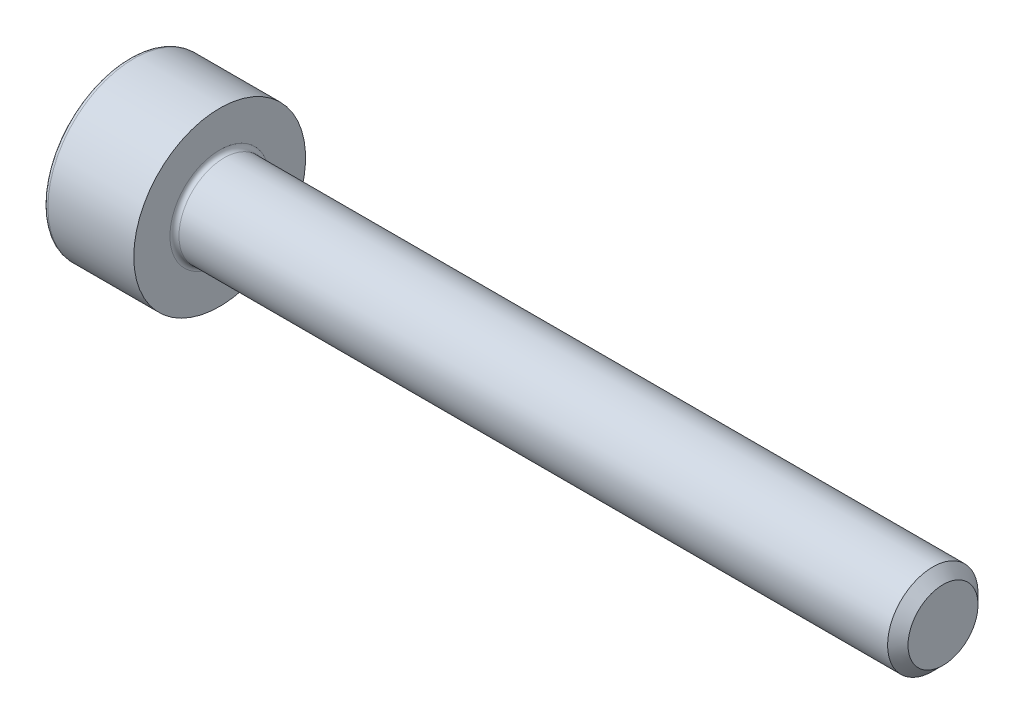
ISO-10303-21;
HEADER;
FILE_DESCRIPTION(('STEP AP214'),'2;1');
FILE_NAME('part.step','',(''),(''),'','','');
FILE_SCHEMA(('AUTOMOTIVE_DESIGN { 1 0 10303 214 1 1 1 1 }'));
ENDSEC;
DATA;
#1=APPLICATION_CONTEXT('core data for automotive mechanical design processes');
#2=APPLICATION_PROTOCOL_DEFINITION('international standard','automotive_design',2000,#1);
#3=PRODUCT_CONTEXT('',#1,'mechanical');
#4=PRODUCT('Part','Part','',(#3));
#5=PRODUCT_RELATED_PRODUCT_CATEGORY('part','',(#4));
#6=PRODUCT_DEFINITION_FORMATION('','',#4);
#7=PRODUCT_DEFINITION_CONTEXT('part definition',#1,'design');
#8=PRODUCT_DEFINITION('design','',#6,#7);
#9=PRODUCT_DEFINITION_SHAPE('','',#8);
#10=(LENGTH_UNIT() NAMED_UNIT(*) SI_UNIT(.MILLI.,.METRE.));
#11=(NAMED_UNIT(*) PLANE_ANGLE_UNIT() SI_UNIT($,.RADIAN.));
#12=(NAMED_UNIT(*) SI_UNIT($,.STERADIAN.) SOLID_ANGLE_UNIT());
#13=UNCERTAINTY_MEASURE_WITH_UNIT(LENGTH_MEASURE(1.E-05),#10,'distance_accuracy_value','');
#14=(GEOMETRIC_REPRESENTATION_CONTEXT(3) GLOBAL_UNCERTAINTY_ASSIGNED_CONTEXT((#13)) GLOBAL_UNIT_ASSIGNED_CONTEXT((#10,
#11,#12)) REPRESENTATION_CONTEXT('',''));
#15=CARTESIAN_POINT('',(0.,0.,0.));
#16=DIRECTION('',(0.,0.,1.));
#17=DIRECTION('',(1.,0.,0.));
#18=AXIS2_PLACEMENT_3D('',#15,#16,#17);
#19=CARTESIAN_POINT('',(0.,0.,0.));
#20=DIRECTION('',(-1.,0.,0.));
#21=DIRECTION('',(0.,0.,1.));
#22=AXIS2_PLACEMENT_3D('',#19,#20,#21);
#23=PLANE('',#22);
#24=DIRECTION('',(0.,-0.499999999999999,0.866025403784439));
#25=VECTOR('',#24,1.);
#26=CARTESIAN_POINT('',(0.,0.892006165897972,0.));
#27=LINE('',#26,#25);
#28=CARTESIAN_POINT('',(0.,0.892006165897972,0.));
#29=VERTEX_POINT('',#28);
#30=CARTESIAN_POINT('',(0.,0.446003082948987,0.772499999999999));
#31=VERTEX_POINT('',#30);
#32=EDGE_CURVE('E265',#29,#31,#27,.T.);
#33=ORIENTED_EDGE('',*,*,#32,.T.);
#34=DIRECTION('',(0.,1.,0.));
#35=VECTOR('',#34,1.);
#36=CARTESIAN_POINT('',(0.,-0.446003082948984,0.7725));
#37=LINE('',#36,#35);
#38=CARTESIAN_POINT('',(0.,-0.446003082948984,0.7725));
#39=VERTEX_POINT('',#38);
#40=EDGE_CURVE('E137',#39,#31,#37,.T.);
#41=ORIENTED_EDGE('',*,*,#40,.F.);
#42=DIRECTION('',(0.,-0.500000000000001,-0.866025403784438));
#43=VECTOR('',#42,1.);
#44=CARTESIAN_POINT('',(0.,-0.446003082948984,0.7725));
#45=LINE('',#44,#43);
#46=CARTESIAN_POINT('',(0.,-0.892006165897971,0.));
#47=VERTEX_POINT('',#46);
#48=EDGE_CURVE('E268',#39,#47,#45,.T.);
#49=ORIENTED_EDGE('',*,*,#48,.T.);
#50=DIRECTION('',(0.,0.499999999999997,-0.86602540378444));
#51=VECTOR('',#50,1.);
#52=CARTESIAN_POINT('',(0.,-0.892006165897971,0.));
#53=LINE('',#52,#51);
#54=CARTESIAN_POINT('',(0.,-0.446003082948987,-0.772500000000001));
#55=VERTEX_POINT('',#54);
#56=EDGE_CURVE('E271',#47,#55,#53,.T.);
#57=ORIENTED_EDGE('',*,*,#56,.T.);
#58=DIRECTION('',(0.,-1.,0.));
#59=VECTOR('',#58,1.);
#60=CARTESIAN_POINT('',(0.,0.446003082948986,-0.772500000000001));
#61=LINE('',#60,#59);
#62=CARTESIAN_POINT('',(0.,0.446003082948986,-0.772500000000001));
#63=VERTEX_POINT('',#62);
#64=EDGE_CURVE('E274',#63,#55,#61,.T.);
#65=ORIENTED_EDGE('',*,*,#64,.F.);
#66=DIRECTION('',(0.,-0.500000000000001,-0.866025403784438));
#67=VECTOR('',#66,1.);
#68=CARTESIAN_POINT('',(0.,0.892006165897972,0.));
#69=LINE('',#68,#67);
#70=EDGE_CURVE('E132',#29,#63,#69,.T.);
#71=ORIENTED_EDGE('',*,*,#70,.F.);
#72=EDGE_LOOP('',(#33,#41,#49,#57,#65,#71));
#73=FACE_BOUND('',#72,.T.);
#74=CARTESIAN_POINT('',(0.,0.,0.));
#75=DIRECTION('',(-1.,0.,0.));
#76=DIRECTION('',(0.,0.,1.));
#77=AXIS2_PLACEMENT_3D('',#74,#75,#76);
#78=CIRCLE('',#77,1.8);
#79=CARTESIAN_POINT('',(0.,0.,1.8));
#80=VERTEX_POINT('',#79);
#81=EDGE_CURVE('E49',#80,#80,#78,.T.);
#82=ORIENTED_EDGE('',*,*,#81,.T.);
#83=EDGE_LOOP('',(#82));
#84=FACE_BOUND('',#83,.T.);
#85=ADVANCED_FACE('F41',(#73,#84),#23,.T.);
#86=CARTESIAN_POINT('',(-31.75,0.,0.));
#87=DIRECTION('',(-1.,0.,0.));
#88=DIRECTION('',(0.,0.,1.));
#89=AXIS2_PLACEMENT_3D('',#86,#87,#88);
#90=CYLINDRICAL_SURFACE('',#89,1.9);
#91=CARTESIAN_POINT('',(0.100000000000003,0.,0.));
#92=DIRECTION('',(-1.,0.,0.));
#93=DIRECTION('',(0.,0.,1.));
#94=AXIS2_PLACEMENT_3D('',#91,#92,#93);
#95=CIRCLE('',#94,1.9);
#96=CARTESIAN_POINT('',(0.100000000000003,0.,1.9));
#97=VERTEX_POINT('',#96);
#98=EDGE_CURVE('E11',#97,#97,#95,.F.);
#99=ORIENTED_EDGE('',*,*,#98,.T.);
#100=EDGE_LOOP('',(#99));
#101=FACE_BOUND('',#100,.T.);
#102=CARTESIAN_POINT('',(2.,0.,0.));
#103=DIRECTION('',(-1.,0.,0.));
#104=DIRECTION('',(0.,0.,1.));
#105=AXIS2_PLACEMENT_3D('',#102,#103,#104);
#106=CIRCLE('',#105,1.9);
#107=CARTESIAN_POINT('',(2.,0.,1.9));
#108=VERTEX_POINT('',#107);
#109=EDGE_CURVE('E155',#108,#108,#106,.T.);
#110=ORIENTED_EDGE('',*,*,#109,.T.);
#111=EDGE_LOOP('',(#110));
#112=FACE_BOUND('',#111,.T.);
#113=ADVANCED_FACE('F179',(#101,#112),#90,.T.);
#114=CARTESIAN_POINT('',(2.00000000000001,1.9,0.));
#115=DIRECTION('',(1.,0.,0.));
#116=DIRECTION('',(0.,0.,-1.));
#117=AXIS2_PLACEMENT_3D('',#114,#115,#116);
#118=PLANE('',#117);
#119=CARTESIAN_POINT('',(2.00000000000001,0.,0.));
#120=DIRECTION('',(1.,0.,0.));
#121=DIRECTION('',(0.,0.,-1.));
#122=AXIS2_PLACEMENT_3D('',#119,#120,#121);
#123=CIRCLE('',#122,1.1);
#124=CARTESIAN_POINT('',(2.00000000000001,0.,-1.1));
#125=VERTEX_POINT('',#124);
#126=EDGE_CURVE('E158',#125,#125,#123,.F.);
#127=ORIENTED_EDGE('',*,*,#126,.T.);
#128=EDGE_LOOP('',(#127));
#129=FACE_BOUND('',#128,.T.);
#130=ORIENTED_EDGE('',*,*,#109,.F.);
#131=EDGE_LOOP('',(#130));
#132=FACE_BOUND('',#131,.T.);
#133=ADVANCED_FACE('F185',(#129,#132),#118,.T.);
#134=CARTESIAN_POINT('',(-31.75,0.,0.));
#135=DIRECTION('',(-1.,0.,0.));
#136=DIRECTION('',(0.,0.,1.));
#137=AXIS2_PLACEMENT_3D('',#134,#135,#136);
#138=CYLINDRICAL_SURFACE('',#137,1.);
#139=CARTESIAN_POINT('',(2.1,0.,0.));
#140=DIRECTION('',(1.,0.,0.));
#141=DIRECTION('',(0.,0.,-1.));
#142=AXIS2_PLACEMENT_3D('',#139,#140,#141);
#143=CIRCLE('',#142,1.);
#144=CARTESIAN_POINT('',(2.1,0.,-1.));
#145=VERTEX_POINT('',#144);
#146=EDGE_CURVE('E161',#145,#145,#143,.T.);
#147=ORIENTED_EDGE('',*,*,#146,.T.);
#148=EDGE_LOOP('',(#147));
#149=FACE_BOUND('',#148,.T.);
#150=CARTESIAN_POINT('',(17.774,0.,0.));
#151=DIRECTION('',(-1.,0.,0.));
#152=DIRECTION('',(0.,0.,1.));
#153=AXIS2_PLACEMENT_3D('',#150,#151,#152);
#154=CIRCLE('',#153,1.);
#155=CARTESIAN_POINT('',(17.774,0.,1.));
#156=VERTEX_POINT('',#155);
#157=EDGE_CURVE('E152',#156,#156,#154,.T.);
#158=ORIENTED_EDGE('',*,*,#157,.T.);
#159=EDGE_LOOP('',(#158));
#160=FACE_BOUND('',#159,.T.);
#161=ADVANCED_FACE('F191',(#149,#160),#138,.T.);
#162=CARTESIAN_POINT('',(18.,0.,0.));
#163=DIRECTION('',(-1.,0.,0.));
#164=DIRECTION('',(0.,0.,1.));
#165=AXIS2_PLACEMENT_3D('',#162,#163,#164);
#166=CONICAL_SURFACE('',#165,0.774,0.785398163397475);
#167=ORIENTED_EDGE('',*,*,#157,.F.);
#168=EDGE_LOOP('',(#167));
#169=FACE_BOUND('',#168,.T.);
#170=CARTESIAN_POINT('',(18.,0.,0.));
#171=DIRECTION('',(-1.,0.,0.));
#172=DIRECTION('',(0.,0.,1.));
#173=AXIS2_PLACEMENT_3D('',#170,#171,#172);
#174=CIRCLE('',#173,0.774);
#175=CARTESIAN_POINT('',(18.,0.,0.774));
#176=VERTEX_POINT('',#175);
#177=EDGE_CURVE('E148',#176,#176,#174,.T.);
#178=ORIENTED_EDGE('',*,*,#177,.T.);
#179=EDGE_LOOP('',(#178));
#180=FACE_BOUND('',#179,.T.);
#181=ADVANCED_FACE('F195',(#169,#180),#166,.T.);
#182=CARTESIAN_POINT('',(18.,0.774,0.));
#183=DIRECTION('',(1.,0.,0.));
#184=DIRECTION('',(0.,0.,-1.));
#185=AXIS2_PLACEMENT_3D('',#182,#183,#184);
#186=PLANE('',#185);
#187=ORIENTED_EDGE('',*,*,#177,.F.);
#188=EDGE_LOOP('',(#187));
#189=FACE_BOUND('',#188,.T.);
#190=ADVANCED_FACE('F175',(#189),#186,.T.);
#191=CARTESIAN_POINT('',(2.1,0.,0.));
#192=DIRECTION('',(1.,0.,0.));
#193=DIRECTION('',(0.,0.,-1.));
#194=AXIS2_PLACEMENT_3D('',#191,#192,#193);
#195=TOROIDAL_SURFACE('',#194,1.1,0.1);
#196=ORIENTED_EDGE('',*,*,#146,.F.);
#197=EDGE_LOOP('',(#196));
#198=FACE_BOUND('',#197,.T.);
#199=ORIENTED_EDGE('',*,*,#126,.F.);
#200=EDGE_LOOP('',(#199));
#201=FACE_BOUND('',#200,.T.);
#202=ADVANCED_FACE('F168',(#198,#201),#195,.F.);
#203=CARTESIAN_POINT('',(0.100000000000003,0.,0.));
#204=DIRECTION('',(-1.,0.,0.));
#205=DIRECTION('',(0.,0.,1.));
#206=AXIS2_PLACEMENT_3D('',#203,#204,#205);
#207=TOROIDAL_SURFACE('',#206,1.8,0.1);
#208=ORIENTED_EDGE('',*,*,#98,.F.);
#209=EDGE_LOOP('',(#208));
#210=FACE_BOUND('',#209,.T.);
#211=ORIENTED_EDGE('',*,*,#81,.F.);
#212=EDGE_LOOP('',(#211));
#213=FACE_BOUND('',#212,.T.);
#214=ADVANCED_FACE('F43',(#210,#213),#207,.T.);
#215=CARTESIAN_POINT('',(1.,0.892006165897972,0.));
#216=DIRECTION('',(0.,-0.866025403784439,-0.499999999999999));
#217=DIRECTION('',(0.,0.499999999999999,-0.866025403784439));
#218=AXIS2_PLACEMENT_3D('',#215,#216,#217);
#219=PLANE('',#218);
#220=ORIENTED_EDGE('',*,*,#32,.F.);
#221=DIRECTION('',(-1.,0.,0.));
#222=VECTOR('',#221,1.);
#223=CARTESIAN_POINT('',(1.,0.892006165897972,0.));
#224=LINE('',#223,#222);
#225=CARTESIAN_POINT('',(1.,0.892006165897972,0.));
#226=VERTEX_POINT('',#225);
#227=EDGE_CURVE('E255',#226,#29,#224,.T.);
#228=ORIENTED_EDGE('',*,*,#227,.F.);
#229=DIRECTION('',(0.,-0.499999999999999,0.866025403784439));
#230=VECTOR('',#229,1.);
#231=CARTESIAN_POINT('',(1.,0.892006165897972,0.));
#232=LINE('',#231,#230);
#233=CARTESIAN_POINT('',(1.,0.669004624423479,0.386249999999999));
#234=VERTEX_POINT('',#233);
#235=EDGE_CURVE('E124',#226,#234,#232,.T.);
#236=ORIENTED_EDGE('',*,*,#235,.T.);
#237=CARTESIAN_POINT('',(1.,0.446003082948987,0.772499999999999));
#238=VERTEX_POINT('',#237);
#239=EDGE_CURVE('E115',#234,#238,#232,.T.);
#240=ORIENTED_EDGE('',*,*,#239,.T.);
#241=DIRECTION('',(-1.,0.,0.));
#242=VECTOR('',#241,1.);
#243=CARTESIAN_POINT('',(1.,0.446003082948987,0.772499999999999));
#244=LINE('',#243,#242);
#245=EDGE_CURVE('E129',#238,#31,#244,.T.);
#246=ORIENTED_EDGE('',*,*,#245,.T.);
#247=EDGE_LOOP('',(#220,#228,#236,#240,#246));
#248=FACE_BOUND('',#247,.T.);
#249=ADVANCED_FACE('F128',(#248),#219,.T.);
#250=CARTESIAN_POINT('',(1.,-0.446003082948984,0.7725));
#251=DIRECTION('',(0.,0.,1.));
#252=DIRECTION('',(0.,-1.,0.));
#253=AXIS2_PLACEMENT_3D('',#250,#251,#252);
#254=PLANE('',#253);
#255=ORIENTED_EDGE('',*,*,#40,.T.);
#256=ORIENTED_EDGE('',*,*,#245,.F.);
#257=DIRECTION('',(0.,1.,0.));
#258=VECTOR('',#257,1.);
#259=CARTESIAN_POINT('',(1.,-0.446003082948984,0.7725));
#260=LINE('',#259,#258);
#261=CARTESIAN_POINT('',(1.,0.,0.772499999999999));
#262=VERTEX_POINT('',#261);
#263=EDGE_CURVE('E112',#262,#238,#260,.T.);
#264=ORIENTED_EDGE('',*,*,#263,.F.);
#265=CARTESIAN_POINT('',(1.,-0.446003082948984,0.7725));
#266=VERTEX_POINT('',#265);
#267=EDGE_CURVE('E123',#266,#262,#260,.T.);
#268=ORIENTED_EDGE('',*,*,#267,.F.);
#269=DIRECTION('',(-1.,0.,0.));
#270=VECTOR('',#269,1.);
#271=CARTESIAN_POINT('',(1.,-0.446003082948984,0.7725));
#272=LINE('',#271,#270);
#273=EDGE_CURVE('E139',#266,#39,#272,.T.);
#274=ORIENTED_EDGE('',*,*,#273,.T.);
#275=EDGE_LOOP('',(#255,#256,#264,#268,#274));
#276=FACE_BOUND('',#275,.T.);
#277=ADVANCED_FACE('F134',(#276),#254,.F.);
#278=CARTESIAN_POINT('',(1.,-0.446003082948984,0.7725));
#279=DIRECTION('',(0.,0.866025403784438,-0.500000000000001));
#280=DIRECTION('',(0.,0.500000000000001,0.866025403784438));
#281=AXIS2_PLACEMENT_3D('',#278,#279,#280);
#282=PLANE('',#281);
#283=ORIENTED_EDGE('',*,*,#48,.F.);
#284=ORIENTED_EDGE('',*,*,#273,.F.);
#285=DIRECTION('',(0.,-0.500000000000001,-0.866025403784438));
#286=VECTOR('',#285,1.);
#287=CARTESIAN_POINT('',(1.,-0.446003082948984,0.7725));
#288=LINE('',#287,#286);
#289=CARTESIAN_POINT('',(1.,-0.669004624423477,0.38625));
#290=VERTEX_POINT('',#289);
#291=EDGE_CURVE('E294',#266,#290,#288,.T.);
#292=ORIENTED_EDGE('',*,*,#291,.T.);
#293=CARTESIAN_POINT('',(1.,-0.892006165897971,0.));
#294=VERTEX_POINT('',#293);
#295=EDGE_CURVE('E283',#290,#294,#288,.T.);
#296=ORIENTED_EDGE('',*,*,#295,.T.);
#297=DIRECTION('',(-1.,0.,0.));
#298=VECTOR('',#297,1.);
#299=CARTESIAN_POINT('',(1.,-0.892006165897971,0.));
#300=LINE('',#299,#298);
#301=EDGE_CURVE('E144',#294,#47,#300,.T.);
#302=ORIENTED_EDGE('',*,*,#301,.T.);
#303=EDGE_LOOP('',(#283,#284,#292,#296,#302));
#304=FACE_BOUND('',#303,.T.);
#305=ADVANCED_FACE('F209',(#304),#282,.T.);
#306=CARTESIAN_POINT('',(1.,-0.892006165897971,0.));
#307=DIRECTION('',(0.,0.86602540378444,0.499999999999997));
#308=DIRECTION('',(0.,-0.499999999999997,0.86602540378444));
#309=AXIS2_PLACEMENT_3D('',#306,#307,#308);
#310=PLANE('',#309);
#311=ORIENTED_EDGE('',*,*,#56,.F.);
#312=ORIENTED_EDGE('',*,*,#301,.F.);
#313=DIRECTION('',(0.,0.499999999999997,-0.86602540378444));
#314=VECTOR('',#313,1.);
#315=CARTESIAN_POINT('',(1.,-0.892006165897971,0.));
#316=LINE('',#315,#314);
#317=CARTESIAN_POINT('',(1.,-0.66900462442348,-0.386249999999998));
#318=VERTEX_POINT('',#317);
#319=EDGE_CURVE('E261',#294,#318,#316,.T.);
#320=ORIENTED_EDGE('',*,*,#319,.T.);
#321=CARTESIAN_POINT('',(1.,-0.446003082948987,-0.772500000000001));
#322=VERTEX_POINT('',#321);
#323=EDGE_CURVE('E293',#318,#322,#316,.T.);
#324=ORIENTED_EDGE('',*,*,#323,.T.);
#325=DIRECTION('',(-1.,0.,0.));
#326=VECTOR('',#325,1.);
#327=CARTESIAN_POINT('',(1.,-0.446003082948987,-0.772500000000001));
#328=LINE('',#327,#326);
#329=EDGE_CURVE('E254',#322,#55,#328,.T.);
#330=ORIENTED_EDGE('',*,*,#329,.T.);
#331=EDGE_LOOP('',(#311,#312,#320,#324,#330));
#332=FACE_BOUND('',#331,.T.);
#333=ADVANCED_FACE('F212',(#332),#310,.T.);
#334=CARTESIAN_POINT('',(1.,0.446003082948986,-0.772500000000001));
#335=DIRECTION('',(0.,0.,-1.));
#336=DIRECTION('',(0.,1.,0.));
#337=AXIS2_PLACEMENT_3D('',#334,#335,#336);
#338=PLANE('',#337);
#339=ORIENTED_EDGE('',*,*,#64,.T.);
#340=ORIENTED_EDGE('',*,*,#329,.F.);
#341=DIRECTION('',(0.,-1.,0.));
#342=VECTOR('',#341,1.);
#343=CARTESIAN_POINT('',(1.,0.446003082948986,-0.772500000000001));
#344=LINE('',#343,#342);
#345=CARTESIAN_POINT('',(1.,0.,-0.772500000000001));
#346=VERTEX_POINT('',#345);
#347=EDGE_CURVE('E258',#346,#322,#344,.T.);
#348=ORIENTED_EDGE('',*,*,#347,.F.);
#349=CARTESIAN_POINT('',(1.,0.446003082948986,-0.772500000000001));
#350=VERTEX_POINT('',#349);
#351=EDGE_CURVE('E56',#350,#346,#344,.T.);
#352=ORIENTED_EDGE('',*,*,#351,.F.);
#353=DIRECTION('',(-1.,0.,0.));
#354=VECTOR('',#353,1.);
#355=CARTESIAN_POINT('',(1.,0.446003082948986,-0.772500000000001));
#356=LINE('',#355,#354);
#357=EDGE_CURVE('E251',#350,#63,#356,.T.);
#358=ORIENTED_EDGE('',*,*,#357,.T.);
#359=EDGE_LOOP('',(#339,#340,#348,#352,#358));
#360=FACE_BOUND('',#359,.T.);
#361=ADVANCED_FACE('F216',(#360),#338,.F.);
#362=CARTESIAN_POINT('',(1.,0.892006165897972,0.));
#363=DIRECTION('',(0.,0.866025403784438,-0.500000000000001));
#364=DIRECTION('',(0.,0.500000000000001,0.866025403784438));
#365=AXIS2_PLACEMENT_3D('',#362,#363,#364);
#366=PLANE('',#365);
#367=ORIENTED_EDGE('',*,*,#70,.T.);
#368=ORIENTED_EDGE('',*,*,#357,.F.);
#369=DIRECTION('',(0.,-0.500000000000001,-0.866025403784438));
#370=VECTOR('',#369,1.);
#371=CARTESIAN_POINT('',(1.,0.892006165897972,0.));
#372=LINE('',#371,#370);
#373=CARTESIAN_POINT('',(1.,0.669004624423479,-0.386250000000001));
#374=VERTEX_POINT('',#373);
#375=EDGE_CURVE('E241',#374,#350,#372,.T.);
#376=ORIENTED_EDGE('',*,*,#375,.F.);
#377=EDGE_CURVE('E247',#226,#374,#372,.T.);
#378=ORIENTED_EDGE('',*,*,#377,.F.);
#379=ORIENTED_EDGE('',*,*,#227,.T.);
#380=EDGE_LOOP('',(#367,#368,#376,#378,#379));
#381=FACE_BOUND('',#380,.T.);
#382=ADVANCED_FACE('F220',(#381),#366,.F.);
#383=CARTESIAN_POINT('',(1.,1.33800924884696,-0.7725));
#384=DIRECTION('',(1.,0.,0.));
#385=DIRECTION('',(0.,0.,-1.));
#386=AXIS2_PLACEMENT_3D('',#383,#384,#385);
#387=PLANE('',#386);
#388=ORIENTED_EDGE('',*,*,#347,.T.);
#389=ORIENTED_EDGE('',*,*,#323,.F.);
#390=CARTESIAN_POINT('',(1.,0.,0.));
#391=DIRECTION('',(-1.,0.,0.));
#392=DIRECTION('',(0.,0.,1.));
#393=AXIS2_PLACEMENT_3D('',#390,#391,#392);
#394=CIRCLE('',#393,0.772500000000001);
#395=EDGE_CURVE('E289',#346,#318,#394,.T.);
#396=ORIENTED_EDGE('',*,*,#395,.F.);
#397=EDGE_LOOP('',(#388,#389,#396));
#398=FACE_BOUND('',#397,.T.);
#399=ADVANCED_FACE('F224',(#398),#387,.F.);
#400=ORIENTED_EDGE('',*,*,#319,.F.);
#401=ORIENTED_EDGE('',*,*,#295,.F.);
#402=EDGE_CURVE('E142',#318,#290,#394,.T.);
#403=ORIENTED_EDGE('',*,*,#402,.F.);
#404=EDGE_LOOP('',(#400,#401,#403));
#405=FACE_BOUND('',#404,.T.);
#406=ADVANCED_FACE('F227',(#405),#387,.F.);
#407=ORIENTED_EDGE('',*,*,#291,.F.);
#408=ORIENTED_EDGE('',*,*,#267,.T.);
#409=EDGE_CURVE('E138',#290,#262,#394,.T.);
#410=ORIENTED_EDGE('',*,*,#409,.F.);
#411=EDGE_LOOP('',(#407,#408,#410));
#412=FACE_BOUND('',#411,.T.);
#413=ADVANCED_FACE('F232',(#412),#387,.F.);
#414=ORIENTED_EDGE('',*,*,#263,.T.);
#415=ORIENTED_EDGE('',*,*,#239,.F.);
#416=EDGE_CURVE('E118',#262,#234,#394,.T.);
#417=ORIENTED_EDGE('',*,*,#416,.F.);
#418=EDGE_LOOP('',(#414,#415,#417));
#419=FACE_BOUND('',#418,.T.);
#420=ADVANCED_FACE('F114',(#419),#387,.F.);
#421=ORIENTED_EDGE('',*,*,#235,.F.);
#422=ORIENTED_EDGE('',*,*,#377,.T.);
#423=EDGE_CURVE('E149',#234,#374,#394,.T.);
#424=ORIENTED_EDGE('',*,*,#423,.F.);
#425=EDGE_LOOP('',(#421,#422,#424));
#426=FACE_BOUND('',#425,.T.);
#427=ADVANCED_FACE('F235',(#426),#387,.F.);
#428=ORIENTED_EDGE('',*,*,#375,.T.);
#429=ORIENTED_EDGE('',*,*,#351,.T.);
#430=EDGE_CURVE('E244',#374,#346,#394,.T.);
#431=ORIENTED_EDGE('',*,*,#430,.F.);
#432=EDGE_LOOP('',(#428,#429,#431));
#433=FACE_BOUND('',#432,.T.);
#434=ADVANCED_FACE('F205',(#433),#387,.F.);
#435=CARTESIAN_POINT('',(1.,0.,0.));
#436=DIRECTION('',(-1.,0.,0.));
#437=DIRECTION('',(0.,0.,1.));
#438=AXIS2_PLACEMENT_3D('',#435,#436,#437);
#439=CONICAL_SURFACE('',#438,0.772500000000001,1.04719755119659);
#440=CARTESIAN_POINT('',(1.446003082949,0.,0.));
#441=VERTEX_POINT('',#440);
#442=VERTEX_LOOP('',#441);
#443=FACE_BOUND('',#442,.T.);
#444=ORIENTED_EDGE('',*,*,#416,.T.);
#445=ORIENTED_EDGE('',*,*,#423,.T.);
#446=ORIENTED_EDGE('',*,*,#430,.T.);
#447=ORIENTED_EDGE('',*,*,#395,.T.);
#448=ORIENTED_EDGE('',*,*,#402,.T.);
#449=ORIENTED_EDGE('',*,*,#409,.T.);
#450=EDGE_LOOP('',(#444,#445,#446,#447,#448,#449));
#451=FACE_BOUND('',#450,.T.);
#452=ADVANCED_FACE('F203',(#443,#451),#439,.F.);
#453=CLOSED_SHELL('',(#85,#113,#133,#161,#181,#190,#202,#214,#249,#277,#305,#333,#361,#382,#399,
#406,#413,#420,#427,#434,#452));
#454=MANIFOLD_SOLID_BREP('B2',#453);
#455=ADVANCED_BREP_SHAPE_REPRESENTATION('',(#18,#454),#14);
#456=SHAPE_DEFINITION_REPRESENTATION(#9,#455);
ENDSEC;
END-ISO-10303-21;
